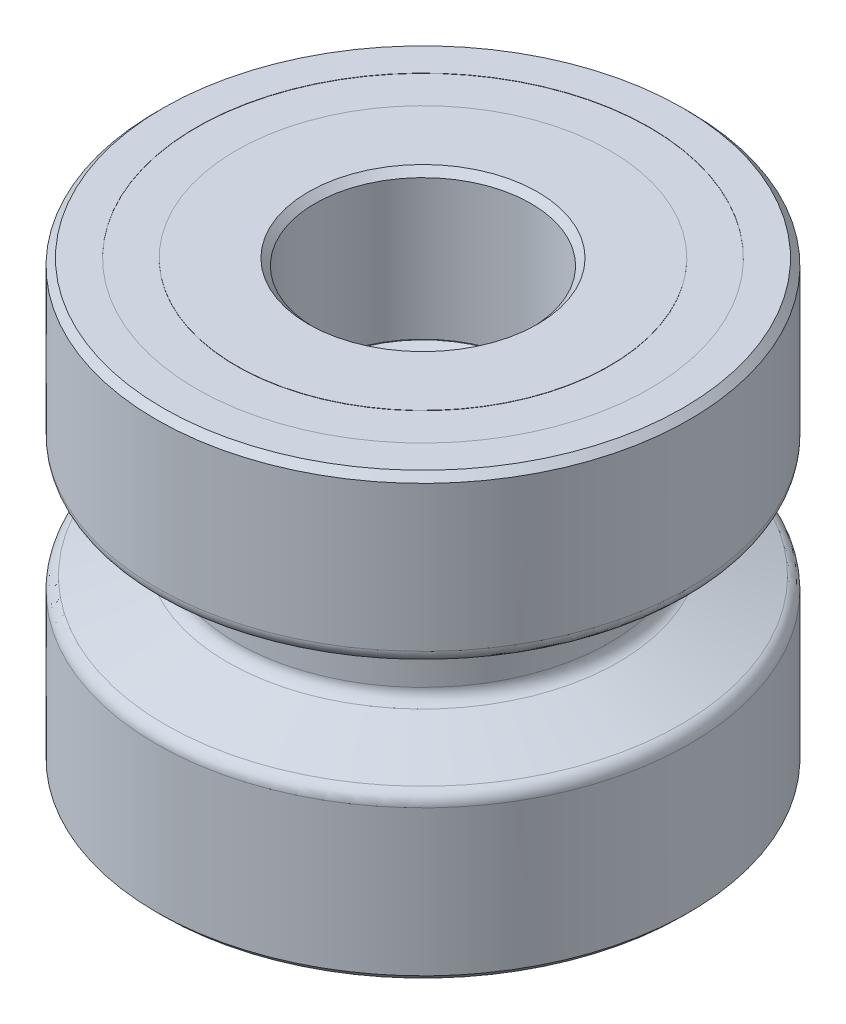
ISO-10303-21;
HEADER;
FILE_DESCRIPTION(('STEP AP214'),'2;1');
FILE_NAME('part.step','',(''),(''),'','','');
FILE_SCHEMA(('AUTOMOTIVE_DESIGN { 1 0 10303 214 1 1 1 1 }'));
ENDSEC;
DATA;
#1=APPLICATION_CONTEXT('core data for automotive mechanical design processes');
#2=APPLICATION_PROTOCOL_DEFINITION('international standard','automotive_design',2000,#1);
#3=PRODUCT_CONTEXT('',#1,'mechanical');
#4=PRODUCT('Part','Part','',(#3));
#5=PRODUCT_RELATED_PRODUCT_CATEGORY('part','',(#4));
#6=PRODUCT_DEFINITION_FORMATION('','',#4);
#7=PRODUCT_DEFINITION_CONTEXT('part definition',#1,'design');
#8=PRODUCT_DEFINITION('design','',#6,#7);
#9=PRODUCT_DEFINITION_SHAPE('','',#8);
#10=(LENGTH_UNIT() NAMED_UNIT(*) SI_UNIT(.MILLI.,.METRE.));
#11=(NAMED_UNIT(*) PLANE_ANGLE_UNIT() SI_UNIT($,.RADIAN.));
#12=(NAMED_UNIT(*) SI_UNIT($,.STERADIAN.) SOLID_ANGLE_UNIT());
#13=UNCERTAINTY_MEASURE_WITH_UNIT(LENGTH_MEASURE(1.E-05),#10,'distance_accuracy_value','');
#14=(GEOMETRIC_REPRESENTATION_CONTEXT(3) GLOBAL_UNCERTAINTY_ASSIGNED_CONTEXT((#13)) GLOBAL_UNIT_ASSIGNED_CONTEXT((#10,
#11,#12)) REPRESENTATION_CONTEXT('',''));
#15=CARTESIAN_POINT('',(0.,0.,0.));
#16=DIRECTION('',(0.,0.,1.));
#17=DIRECTION('',(1.,0.,0.));
#18=AXIS2_PLACEMENT_3D('',#15,#16,#17);
#19=CARTESIAN_POINT('',(0.,8.25,0.));
#20=DIRECTION('',(0.,1.,0.));
#21=DIRECTION('',(0.,0.,-1.));
#22=AXIS2_PLACEMENT_3D('',#19,#20,#21);
#23=PLANE('',#22);
#24=CARTESIAN_POINT('',(0.,8.25,0.));
#25=DIRECTION('',(0.,-1.,0.));
#26=DIRECTION('',(0.,0.,-1.));
#27=AXIS2_PLACEMENT_3D('',#24,#25,#26);
#28=CIRCLE('',#27,4.30000000000001);
#29=CARTESIAN_POINT('',(0.,8.25,-4.30000000000001));
#30=VERTEX_POINT('',#29);
#31=EDGE_CURVE('E65',#30,#30,#28,.F.);
#32=ORIENTED_EDGE('',*,*,#31,.F.);
#33=EDGE_LOOP('',(#32));
#34=FACE_BOUND('',#33,.T.);
#35=CARTESIAN_POINT('',(0.,8.25,0.));
#36=DIRECTION('',(0.,-1.,0.));
#37=DIRECTION('',(0.,0.,-1.));
#38=AXIS2_PLACEMENT_3D('',#35,#36,#37);
#39=CIRCLE('',#38,7.);
#40=CARTESIAN_POINT('',(0.,8.25,-7.));
#41=VERTEX_POINT('',#40);
#42=EDGE_CURVE('E121',#41,#41,#39,.T.);
#43=ORIENTED_EDGE('',*,*,#42,.F.);
#44=EDGE_LOOP('',(#43));
#45=FACE_BOUND('',#44,.T.);
#46=ADVANCED_FACE('F44',(#34,#45),#23,.T.);
#47=CARTESIAN_POINT('',(0.,8.251,0.));
#48=DIRECTION('',(0.,-1.,0.));
#49=DIRECTION('',(0.,0.,1.));
#50=AXIS2_PLACEMENT_3D('',#47,#48,#49);
#51=CYLINDRICAL_SURFACE('',#50,3.5);
#52=CARTESIAN_POINT('',(0.,2.45,0.));
#53=DIRECTION('',(0.,-1.,0.));
#54=DIRECTION('',(0.,0.,-1.));
#55=AXIS2_PLACEMENT_3D('',#52,#53,#54);
#56=CIRCLE('',#55,3.5);
#57=CARTESIAN_POINT('',(0.,2.45,-3.5));
#58=VERTEX_POINT('',#57);
#59=EDGE_CURVE('E10',#58,#58,#56,.T.);
#60=ORIENTED_EDGE('',*,*,#59,.F.);
#61=EDGE_LOOP('',(#60));
#62=FACE_BOUND('',#61,.T.);
#63=CARTESIAN_POINT('',(0.,-5.75,0.));
#64=DIRECTION('',(0.,1.,0.));
#65=DIRECTION('',(0.,0.,1.));
#66=AXIS2_PLACEMENT_3D('',#63,#64,#65);
#67=CIRCLE('',#66,3.5);
#68=CARTESIAN_POINT('',(0.,-5.75,3.5));
#69=VERTEX_POINT('',#68);
#70=EDGE_CURVE('E84',#69,#69,#67,.F.);
#71=ORIENTED_EDGE('',*,*,#70,.T.);
#72=EDGE_LOOP('',(#71));
#73=FACE_BOUND('',#72,.T.);
#74=ADVANCED_FACE('F139',(#62,#73),#51,.F.);
#75=CARTESIAN_POINT('',(0.,8.25,0.));
#76=DIRECTION('',(0.,-1.,0.));
#77=DIRECTION('',(0.,0.,1.));
#78=AXIS2_PLACEMENT_3D('',#75,#76,#77);
#79=CYLINDRICAL_SURFACE('',#78,10.);
#80=CARTESIAN_POINT('',(0.,-7.99999999999999,0.));
#81=DIRECTION('',(0.,-1.,0.));
#82=DIRECTION('',(0.,0.,-1.));
#83=AXIS2_PLACEMENT_3D('',#80,#81,#82);
#84=CIRCLE('',#83,10.);
#85=CARTESIAN_POINT('',(0.,-7.99999999999999,-10.));
#86=VERTEX_POINT('',#85);
#87=EDGE_CURVE('E79',#86,#86,#84,.T.);
#88=ORIENTED_EDGE('',*,*,#87,.F.);
#89=EDGE_LOOP('',(#88));
#90=FACE_BOUND('',#89,.T.);
#91=CARTESIAN_POINT('',(0.,-2.54201447190344,0.));
#92=DIRECTION('',(0.,1.,0.));
#93=DIRECTION('',(0.,0.,1.));
#94=AXIS2_PLACEMENT_3D('',#91,#92,#93);
#95=CIRCLE('',#94,10.);
#96=CARTESIAN_POINT('',(0.,-2.54201447190344,10.));
#97=VERTEX_POINT('',#96);
#98=EDGE_CURVE('E81',#97,#97,#95,.T.);
#99=ORIENTED_EDGE('',*,*,#98,.F.);
#100=EDGE_LOOP('',(#99));
#101=FACE_BOUND('',#100,.T.);
#102=ADVANCED_FACE('F150',(#90,#101),#79,.T.);
#103=CARTESIAN_POINT('',(0.,8.,0.));
#104=DIRECTION('',(0.,-1.,0.));
#105=DIRECTION('',(0.,0.,-1.));
#106=AXIS2_PLACEMENT_3D('',#103,#104,#105);
#107=CIRCLE('',#106,10.);
#108=CARTESIAN_POINT('',(0.,8.,-10.));
#109=VERTEX_POINT('',#108);
#110=EDGE_CURVE('E57',#109,#109,#107,.F.);
#111=ORIENTED_EDGE('',*,*,#110,.F.);
#112=EDGE_LOOP('',(#111));
#113=FACE_BOUND('',#112,.T.);
#114=CARTESIAN_POINT('',(0.,2.54201447190344,0.));
#115=DIRECTION('',(0.,1.,0.));
#116=DIRECTION('',(0.,0.,1.));
#117=AXIS2_PLACEMENT_3D('',#114,#115,#116);
#118=CIRCLE('',#117,10.);
#119=CARTESIAN_POINT('',(0.,2.54201447190344,10.));
#120=VERTEX_POINT('',#119);
#121=EDGE_CURVE('E91',#120,#120,#118,.F.);
#122=ORIENTED_EDGE('',*,*,#121,.F.);
#123=EDGE_LOOP('',(#122));
#124=FACE_BOUND('',#123,.T.);
#125=ADVANCED_FACE('F153',(#113,#124),#79,.T.);
#126=CARTESIAN_POINT('',(0.,8.25,0.));
#127=DIRECTION('',(0.,-1.,0.));
#128=DIRECTION('',(0.,0.,-1.));
#129=AXIS2_PLACEMENT_3D('',#126,#127,#128);
#130=CIRCLE('',#129,9.75);
#131=CARTESIAN_POINT('',(0.,8.25,-9.75));
#132=VERTEX_POINT('',#131);
#133=EDGE_CURVE('E58',#132,#132,#130,.T.);
#134=ORIENTED_EDGE('',*,*,#133,.F.);
#135=EDGE_LOOP('',(#134));
#136=FACE_BOUND('',#135,.T.);
#137=CARTESIAN_POINT('',(0.,8.25,0.));
#138=DIRECTION('',(0.,-1.,0.));
#139=DIRECTION('',(0.,0.,-1.));
#140=AXIS2_PLACEMENT_3D('',#137,#138,#139);
#141=CIRCLE('',#140,8.5);
#142=CARTESIAN_POINT('',(0.,8.25,-8.5));
#143=VERTEX_POINT('',#142);
#144=EDGE_CURVE('E117',#143,#143,#141,.T.);
#145=ORIENTED_EDGE('',*,*,#144,.T.);
#146=EDGE_LOOP('',(#145));
#147=FACE_BOUND('',#146,.T.);
#148=ADVANCED_FACE('F142',(#136,#147),#23,.T.);
#149=CARTESIAN_POINT('',(0.,-8.25,0.));
#150=DIRECTION('',(0.,1.,0.));
#151=DIRECTION('',(0.,0.,-1.));
#152=AXIS2_PLACEMENT_3D('',#149,#150,#151);
#153=PLANE('',#152);
#154=CARTESIAN_POINT('',(0.,-8.25,0.));
#155=DIRECTION('',(0.,-1.,0.));
#156=DIRECTION('',(0.,0.,-1.));
#157=AXIS2_PLACEMENT_3D('',#154,#155,#156);
#158=CIRCLE('',#157,9.74999999999999);
#159=CARTESIAN_POINT('',(0.,-8.25,-9.74999999999999));
#160=VERTEX_POINT('',#159);
#161=EDGE_CURVE('E73',#160,#160,#158,.F.);
#162=ORIENTED_EDGE('',*,*,#161,.F.);
#163=EDGE_LOOP('',(#162));
#164=FACE_BOUND('',#163,.T.);
#165=CARTESIAN_POINT('',(0.,-8.25,0.));
#166=DIRECTION('',(0.,-1.,0.));
#167=DIRECTION('',(0.,0.,-1.));
#168=AXIS2_PLACEMENT_3D('',#165,#166,#167);
#169=CIRCLE('',#168,4.30000000000001);
#170=CARTESIAN_POINT('',(0.,-8.25,-4.30000000000001));
#171=VERTEX_POINT('',#170);
#172=EDGE_CURVE('E77',#171,#171,#169,.T.);
#173=ORIENTED_EDGE('',*,*,#172,.F.);
#174=EDGE_LOOP('',(#173));
#175=FACE_BOUND('',#174,.T.);
#176=ADVANCED_FACE('F154',(#164,#175),#153,.F.);
#177=CARTESIAN_POINT('',(0.,-1.1,0.));
#178=DIRECTION('',(0.,-1.,0.));
#179=DIRECTION('',(0.,0.,1.));
#180=AXIS2_PLACEMENT_3D('',#177,#178,#179);
#181=CONICAL_SURFACE('',#180,7.,1.22173047639604);
#182=CARTESIAN_POINT('',(0.,-1.21974254128809,0.));
#183=DIRECTION('',(0.,1.,0.));
#184=DIRECTION('',(0.,0.,1.));
#185=AXIS2_PLACEMENT_3D('',#182,#183,#184);
#186=CIRCLE('',#185,7.32898992833717);
#187=CARTESIAN_POINT('',(0.,-1.21974254128809,7.32898992833717));
#188=VERTEX_POINT('',#187);
#189=EDGE_CURVE('E99',#188,#188,#186,.T.);
#190=ORIENTED_EDGE('',*,*,#189,.F.);
#191=EDGE_LOOP('',(#190));
#192=FACE_BOUND('',#191,.T.);
#193=CARTESIAN_POINT('',(0.,-2.07216816151049,0.));
#194=DIRECTION('',(0.,1.,0.));
#195=DIRECTION('',(0.,0.,1.));
#196=AXIS2_PLACEMENT_3D('',#193,#194,#195);
#197=CIRCLE('',#196,9.67101007166283);
#198=CARTESIAN_POINT('',(0.,-2.07216816151049,9.67101007166283));
#199=VERTEX_POINT('',#198);
#200=EDGE_CURVE('E104',#199,#199,#197,.F.);
#201=ORIENTED_EDGE('',*,*,#200,.F.);
#202=EDGE_LOOP('',(#201));
#203=FACE_BOUND('',#202,.T.);
#204=ADVANCED_FACE('F158',(#192,#203),#181,.T.);
#205=CARTESIAN_POINT('',(0.,8.25,0.));
#206=DIRECTION('',(0.,1.,0.));
#207=DIRECTION('',(0.,0.,-1.));
#208=AXIS2_PLACEMENT_3D('',#205,#206,#207);
#209=CYLINDRICAL_SURFACE('',#208,7.);
#210=CARTESIAN_POINT('',(0.,-0.749896230895143,0.));
#211=DIRECTION('',(0.,-1.,0.));
#212=DIRECTION('',(0.,0.,-1.));
#213=AXIS2_PLACEMENT_3D('',#210,#211,#212);
#214=CIRCLE('',#213,7.);
#215=CARTESIAN_POINT('',(0.,-0.749896230895143,-7.));
#216=VERTEX_POINT('',#215);
#217=EDGE_CURVE('E106',#216,#216,#214,.T.);
#218=ORIENTED_EDGE('',*,*,#217,.F.);
#219=EDGE_LOOP('',(#218));
#220=FACE_BOUND('',#219,.T.);
#221=CARTESIAN_POINT('',(0.,0.749896230895143,0.));
#222=DIRECTION('',(0.,-1.,0.));
#223=DIRECTION('',(0.,0.,-1.));
#224=AXIS2_PLACEMENT_3D('',#221,#222,#223);
#225=CIRCLE('',#224,7.);
#226=CARTESIAN_POINT('',(0.,0.749896230895143,-7.));
#227=VERTEX_POINT('',#226);
#228=EDGE_CURVE('E90',#227,#227,#225,.F.);
#229=ORIENTED_EDGE('',*,*,#228,.F.);
#230=EDGE_LOOP('',(#229));
#231=FACE_BOUND('',#230,.T.);
#232=ADVANCED_FACE('F198',(#220,#231),#209,.T.);
#233=CARTESIAN_POINT('',(0.,2.19191070279859,0.));
#234=DIRECTION('',(0.,1.,0.));
#235=DIRECTION('',(0.,0.,-1.));
#236=AXIS2_PLACEMENT_3D('',#233,#234,#235);
#237=CONICAL_SURFACE('',#236,10.,1.22173047639604);
#238=CARTESIAN_POINT('',(0.,1.2197425412881,0.));
#239=DIRECTION('',(0.,-1.,0.));
#240=DIRECTION('',(0.,0.,-1.));
#241=AXIS2_PLACEMENT_3D('',#238,#239,#240);
#242=CIRCLE('',#241,7.32898992833717);
#243=CARTESIAN_POINT('',(0.,1.2197425412881,-7.32898992833717));
#244=VERTEX_POINT('',#243);
#245=EDGE_CURVE('E92',#244,#244,#242,.T.);
#246=ORIENTED_EDGE('',*,*,#245,.F.);
#247=EDGE_LOOP('',(#246));
#248=FACE_BOUND('',#247,.T.);
#249=CARTESIAN_POINT('',(0.,2.07216816151049,0.));
#250=DIRECTION('',(0.,-1.,0.));
#251=DIRECTION('',(0.,0.,-1.));
#252=AXIS2_PLACEMENT_3D('',#249,#250,#251);
#253=CIRCLE('',#252,9.67101007166283);
#254=CARTESIAN_POINT('',(0.,2.07216816151049,-9.67101007166283));
#255=VERTEX_POINT('',#254);
#256=EDGE_CURVE('E100',#255,#255,#253,.F.);
#257=ORIENTED_EDGE('',*,*,#256,.F.);
#258=EDGE_LOOP('',(#257));
#259=FACE_BOUND('',#258,.T.);
#260=ADVANCED_FACE('F193',(#248,#259),#237,.T.);
#261=CARTESIAN_POINT('',(0.,-0.749896230895143,0.));
#262=DIRECTION('',(0.,1.,0.));
#263=DIRECTION('',(0.,0.,-1.));
#264=AXIS2_PLACEMENT_3D('',#261,#262,#263);
#265=TOROIDAL_SURFACE('',#264,7.5,0.5);
#266=ORIENTED_EDGE('',*,*,#189,.T.);
#267=EDGE_LOOP('',(#266));
#268=FACE_BOUND('',#267,.T.);
#269=ORIENTED_EDGE('',*,*,#217,.T.);
#270=EDGE_LOOP('',(#269));
#271=FACE_BOUND('',#270,.T.);
#272=ADVANCED_FACE('F199',(#268,#271),#265,.F.);
#273=CARTESIAN_POINT('',(0.,0.749896230895143,0.));
#274=DIRECTION('',(0.,1.,0.));
#275=DIRECTION('',(0.,0.,-1.));
#276=AXIS2_PLACEMENT_3D('',#273,#274,#275);
#277=TOROIDAL_SURFACE('',#276,7.5,0.5);
#278=ORIENTED_EDGE('',*,*,#228,.T.);
#279=EDGE_LOOP('',(#278));
#280=FACE_BOUND('',#279,.T.);
#281=ORIENTED_EDGE('',*,*,#245,.T.);
#282=EDGE_LOOP('',(#281));
#283=FACE_BOUND('',#282,.T.);
#284=ADVANCED_FACE('F219',(#280,#283),#277,.F.);
#285=CARTESIAN_POINT('',(0.,2.54201447190344,0.));
#286=DIRECTION('',(0.,-1.,0.));
#287=DIRECTION('',(0.,0.,1.));
#288=AXIS2_PLACEMENT_3D('',#285,#286,#287);
#289=TOROIDAL_SURFACE('',#288,9.5,0.5);
#290=ORIENTED_EDGE('',*,*,#256,.T.);
#291=EDGE_LOOP('',(#290));
#292=FACE_BOUND('',#291,.T.);
#293=ORIENTED_EDGE('',*,*,#121,.T.);
#294=EDGE_LOOP('',(#293));
#295=FACE_BOUND('',#294,.T.);
#296=ADVANCED_FACE('F211',(#292,#295),#289,.T.);
#297=CARTESIAN_POINT('',(0.,-2.54201447190344,0.));
#298=DIRECTION('',(0.,-1.,0.));
#299=DIRECTION('',(0.,0.,1.));
#300=AXIS2_PLACEMENT_3D('',#297,#298,#299);
#301=TOROIDAL_SURFACE('',#300,9.5,0.5);
#302=ORIENTED_EDGE('',*,*,#98,.T.);
#303=EDGE_LOOP('',(#302));
#304=FACE_BOUND('',#303,.T.);
#305=ORIENTED_EDGE('',*,*,#200,.T.);
#306=EDGE_LOOP('',(#305));
#307=FACE_BOUND('',#306,.T.);
#308=ADVANCED_FACE('F189',(#304,#307),#301,.T.);
#309=CARTESIAN_POINT('',(0.,-5.75,0.));
#310=DIRECTION('',(0.,-1.,0.));
#311=DIRECTION('',(0.,0.,1.));
#312=AXIS2_PLACEMENT_3D('',#309,#310,#311);
#313=PLANE('',#312);
#314=CARTESIAN_POINT('',(0.,-5.75,0.));
#315=DIRECTION('',(0.,1.,0.));
#316=DIRECTION('',(0.,0.,1.));
#317=AXIS2_PLACEMENT_3D('',#314,#315,#316);
#318=CIRCLE('',#317,4.05);
#319=CARTESIAN_POINT('',(0.,-5.75,4.05));
#320=VERTEX_POINT('',#319);
#321=EDGE_CURVE('E88',#320,#320,#318,.T.);
#322=ORIENTED_EDGE('',*,*,#321,.F.);
#323=EDGE_LOOP('',(#322));
#324=FACE_BOUND('',#323,.T.);
#325=ORIENTED_EDGE('',*,*,#70,.F.);
#326=EDGE_LOOP('',(#325));
#327=FACE_BOUND('',#326,.T.);
#328=ADVANCED_FACE('F190',(#324,#327),#313,.T.);
#329=CARTESIAN_POINT('',(0.,-5.75,0.));
#330=DIRECTION('',(0.,-1.,0.));
#331=DIRECTION('',(0.,0.,1.));
#332=AXIS2_PLACEMENT_3D('',#329,#330,#331);
#333=CYLINDRICAL_SURFACE('',#332,4.05);
#334=CARTESIAN_POINT('',(0.,-7.99999999999999,0.));
#335=DIRECTION('',(0.,-1.,0.));
#336=DIRECTION('',(0.,0.,-1.));
#337=AXIS2_PLACEMENT_3D('',#334,#335,#336);
#338=CIRCLE('',#337,4.05);
#339=CARTESIAN_POINT('',(0.,-7.99999999999999,-4.05));
#340=VERTEX_POINT('',#339);
#341=EDGE_CURVE('E71',#340,#340,#338,.F.);
#342=ORIENTED_EDGE('',*,*,#341,.F.);
#343=EDGE_LOOP('',(#342));
#344=FACE_BOUND('',#343,.T.);
#345=ORIENTED_EDGE('',*,*,#321,.T.);
#346=EDGE_LOOP('',(#345));
#347=FACE_BOUND('',#346,.T.);
#348=ADVANCED_FACE('F182',(#344,#347),#333,.F.);
#349=CARTESIAN_POINT('',(0.,2.75,0.));
#350=DIRECTION('',(0.,1.,0.));
#351=DIRECTION('',(0.,0.,-1.));
#352=AXIS2_PLACEMENT_3D('',#349,#350,#351);
#353=PLANE('',#352);
#354=CARTESIAN_POINT('',(0.,2.75,0.));
#355=DIRECTION('',(0.,-1.,0.));
#356=DIRECTION('',(0.,0.,-1.));
#357=AXIS2_PLACEMENT_3D('',#354,#355,#356);
#358=CIRCLE('',#357,4.01961524227066);
#359=CARTESIAN_POINT('',(0.,2.75,-4.01961524227066));
#360=VERTEX_POINT('',#359);
#361=EDGE_CURVE('E55',#360,#360,#358,.F.);
#362=ORIENTED_EDGE('',*,*,#361,.F.);
#363=EDGE_LOOP('',(#362));
#364=FACE_BOUND('',#363,.T.);
#365=CARTESIAN_POINT('',(0.,2.75,0.));
#366=DIRECTION('',(0.,-1.,0.));
#367=DIRECTION('',(0.,0.,-1.));
#368=AXIS2_PLACEMENT_3D('',#365,#366,#367);
#369=CIRCLE('',#368,4.05);
#370=CARTESIAN_POINT('',(0.,2.75,-4.05));
#371=VERTEX_POINT('',#370);
#372=EDGE_CURVE('E111',#371,#371,#369,.T.);
#373=ORIENTED_EDGE('',*,*,#372,.F.);
#374=EDGE_LOOP('',(#373));
#375=FACE_BOUND('',#374,.T.);
#376=ADVANCED_FACE('F177',(#364,#375),#353,.T.);
#377=CARTESIAN_POINT('',(0.,2.75,0.));
#378=DIRECTION('',(0.,1.,0.));
#379=DIRECTION('',(0.,0.,-1.));
#380=AXIS2_PLACEMENT_3D('',#377,#378,#379);
#381=CYLINDRICAL_SURFACE('',#380,4.05);
#382=CARTESIAN_POINT('',(0.,7.99999999999999,0.));
#383=DIRECTION('',(0.,-1.,0.));
#384=DIRECTION('',(0.,0.,-1.));
#385=AXIS2_PLACEMENT_3D('',#382,#383,#384);
#386=CIRCLE('',#385,4.05);
#387=CARTESIAN_POINT('',(0.,7.99999999999999,-4.05));
#388=VERTEX_POINT('',#387);
#389=EDGE_CURVE('E66',#388,#388,#386,.T.);
#390=ORIENTED_EDGE('',*,*,#389,.F.);
#391=EDGE_LOOP('',(#390));
#392=FACE_BOUND('',#391,.T.);
#393=ORIENTED_EDGE('',*,*,#372,.T.);
#394=EDGE_LOOP('',(#393));
#395=FACE_BOUND('',#394,.T.);
#396=ADVANCED_FACE('F169',(#392,#395),#381,.F.);
#397=CARTESIAN_POINT('',(0.,8.24,0.));
#398=DIRECTION('',(0.,1.,0.));
#399=DIRECTION('',(0.,0.,-1.));
#400=AXIS2_PLACEMENT_3D('',#397,#398,#399);
#401=CYLINDRICAL_SURFACE('',#400,8.5);
#402=CARTESIAN_POINT('',(0.,8.24,0.));
#403=DIRECTION('',(0.,-1.,0.));
#404=DIRECTION('',(0.,0.,-1.));
#405=AXIS2_PLACEMENT_3D('',#402,#403,#404);
#406=CIRCLE('',#405,8.5);
#407=CARTESIAN_POINT('',(0.,8.24,-8.5));
#408=VERTEX_POINT('',#407);
#409=EDGE_CURVE('E116',#408,#408,#406,.T.);
#410=CARTESIAN_POINT('',(0.,8.24,-8.5));
#411=CARTESIAN_POINT('',(0.,8.24010416666667,-8.5));
#412=CARTESIAN_POINT('',(0.,8.24020833333334,-8.5));
#413=CARTESIAN_POINT('',(0.,8.24041666666667,-8.5));
#414=CARTESIAN_POINT('',(0.,8.24052083333333,-8.5));
#415=CARTESIAN_POINT('',(0.,8.24072916666667,-8.5));
#416=CARTESIAN_POINT('',(0.,8.24083333333333,-8.5));
#417=CARTESIAN_POINT('',(0.,8.24104166666667,-8.5));
#418=CARTESIAN_POINT('',(0.,8.24114583333333,-8.5));
#419=CARTESIAN_POINT('',(0.,8.24135416666667,-8.5));
#420=CARTESIAN_POINT('',(0.,8.24145833333334,-8.5));
#421=CARTESIAN_POINT('',(0.,8.24166666666667,-8.5));
#422=CARTESIAN_POINT('',(0.,8.24177083333334,-8.5));
#423=CARTESIAN_POINT('',(0.,8.24197916666667,-8.5));
#424=CARTESIAN_POINT('',(0.,8.24208333333333,-8.5));
#425=CARTESIAN_POINT('',(0.,8.24229166666667,-8.5));
#426=CARTESIAN_POINT('',(0.,8.24239583333333,-8.5));
#427=CARTESIAN_POINT('',(0.,8.24260416666667,-8.5));
#428=CARTESIAN_POINT('',(0.,8.24270833333333,-8.5));
#429=CARTESIAN_POINT('',(0.,8.24291666666667,-8.5));
#430=CARTESIAN_POINT('',(0.,8.24302083333333,-8.5));
#431=CARTESIAN_POINT('',(0.,8.24322916666667,-8.5));
#432=CARTESIAN_POINT('',(0.,8.24333333333334,-8.5));
#433=CARTESIAN_POINT('',(0.,8.24354166666667,-8.5));
#434=CARTESIAN_POINT('',(0.,8.24364583333333,-8.5));
#435=CARTESIAN_POINT('',(0.,8.24385416666667,-8.5));
#436=CARTESIAN_POINT('',(0.,8.24395833333333,-8.5));
#437=CARTESIAN_POINT('',(0.,8.24416666666667,-8.5));
#438=CARTESIAN_POINT('',(0.,8.24427083333333,-8.5));
#439=CARTESIAN_POINT('',(0.,8.24447916666667,-8.5));
#440=CARTESIAN_POINT('',(0.,8.24458333333333,-8.5));
#441=CARTESIAN_POINT('',(0.,8.24479166666667,-8.5));
#442=CARTESIAN_POINT('',(0.,8.24489583333333,-8.5));
#443=CARTESIAN_POINT('',(0.,8.24510416666667,-8.5));
#444=CARTESIAN_POINT('',(0.,8.24520833333334,-8.5));
#445=CARTESIAN_POINT('',(0.,8.24541666666667,-8.5));
#446=CARTESIAN_POINT('',(0.,8.24552083333333,-8.5));
#447=CARTESIAN_POINT('',(0.,8.24572916666667,-8.5));
#448=CARTESIAN_POINT('',(0.,8.24583333333333,-8.5));
#449=CARTESIAN_POINT('',(0.,8.24604166666667,-8.5));
#450=CARTESIAN_POINT('',(0.,8.24614583333334,-8.5));
#451=CARTESIAN_POINT('',(0.,8.24635416666667,-8.5));
#452=CARTESIAN_POINT('',(0.,8.24645833333333,-8.5));
#453=CARTESIAN_POINT('',(0.,8.24666666666667,-8.5));
#454=CARTESIAN_POINT('',(0.,8.24677083333333,-8.5));
#455=CARTESIAN_POINT('',(0.,8.24697916666667,-8.5));
#456=CARTESIAN_POINT('',(0.,8.24708333333333,-8.5));
#457=CARTESIAN_POINT('',(0.,8.24729166666667,-8.5));
#458=CARTESIAN_POINT('',(0.,8.24739583333333,-8.5));
#459=CARTESIAN_POINT('',(0.,8.24760416666667,-8.5));
#460=CARTESIAN_POINT('',(0.,8.24770833333333,-8.5));
#461=CARTESIAN_POINT('',(0.,8.24791666666667,-8.5));
#462=CARTESIAN_POINT('',(0.,8.24802083333334,-8.5));
#463=CARTESIAN_POINT('',(0.,8.24822916666667,-8.5));
#464=CARTESIAN_POINT('',(0.,8.24833333333333,-8.5));
#465=CARTESIAN_POINT('',(0.,8.24854166666667,-8.5));
#466=CARTESIAN_POINT('',(0.,8.24864583333333,-8.5));
#467=CARTESIAN_POINT('',(0.,8.24885416666667,-8.5));
#468=CARTESIAN_POINT('',(0.,8.24895833333333,-8.5));
#469=CARTESIAN_POINT('',(0.,8.24916666666667,-8.5));
#470=CARTESIAN_POINT('',(0.,8.24927083333333,-8.5));
#471=CARTESIAN_POINT('',(0.,8.24947916666667,-8.5));
#472=CARTESIAN_POINT('',(0.,8.24958333333333,-8.5));
#473=CARTESIAN_POINT('',(0.,8.24979166666667,-8.5));
#474=CARTESIAN_POINT('',(0.,8.24989583333334,-8.5));
#475=CARTESIAN_POINT('',(0.,8.25,-8.5));
#476=B_SPLINE_CURVE_WITH_KNOTS('',3,(#410,#411,#412,#413,#414,#415,#416,#417,#418,#419,#420,
#421,#422,#423,#424,#425,#426,#427,#428,#429,#430,#431,#432,#433,#434,#435,#436,#437,#438,#439,
#440,#441,#442,#443,#444,#445,#446,#447,#448,#449,#450,#451,#452,#453,#454,#455,#456,#457,#458,
#459,#460,#461,#462,#463,#464,#465,#466,#467,#468,#469,#470,#471,#472,#473,#474,#475),
.UNSPECIFIED.,.F.,.F.,(4,2,2,2,2,2,2,2,2,2,2,2,2,2,2,2,2,2,2,2,2,2,2,2,2,2,2,2,2,2,2,2,4),(0.,
0.000312499999998578,0.00062499999999889,0.000937499999999203,0.00124999999999952,
0.00156249999999983,0.00187499999999841,0.00218749999999872,0.00249999999999903,
0.00281249999999934,0.00312499999999966,0.00343749999999823,0.00374999999999855,
0.00406249999999886,0.00437499999999917,0.00468749999999948,0.0049999999999998,
0.00531249999999837,0.00562499999999869,0.005937499999999,0.00624999999999931,
0.00656249999999962,0.0068749999999982,0.00718749999999851,0.00749999999999883,
0.00781249999999914,0.00812499999999945,0.00843749999999803,0.00874999999999834,
0.00906249999999865,0.00937499999999897,0.00968749999999928,0.00999999999999959),.UNSPECIFIED.);
#477=EDGE_CURVE('BSEAM166',#408,#143,#476,.T.);
#478=ORIENTED_EDGE('',*,*,#409,.T.);
#479=ORIENTED_EDGE('',*,*,#144,.F.);
#480=ORIENTED_EDGE('',*,*,#477,.T.);
#481=ORIENTED_EDGE('',*,*,#477,.F.);
#482=EDGE_LOOP('',(#478,#480,#479,#481));
#483=FACE_BOUND('',#482,.T.);
#484=ADVANCED_FACE('F166',(#483),#401,.F.);
#485=CARTESIAN_POINT('',(0.,8.24,0.));
#486=DIRECTION('',(0.,1.,0.));
#487=DIRECTION('',(0.,0.,-1.));
#488=AXIS2_PLACEMENT_3D('',#485,#486,#487);
#489=PLANE('',#488);
#490=CARTESIAN_POINT('',(0.,8.24,0.));
#491=DIRECTION('',(0.,-1.,0.));
#492=DIRECTION('',(0.,0.,-1.));
#493=AXIS2_PLACEMENT_3D('',#490,#491,#492);
#494=CIRCLE('',#493,7.);
#495=CARTESIAN_POINT('',(0.,8.24,-7.));
#496=VERTEX_POINT('',#495);
#497=EDGE_CURVE('E120',#496,#496,#494,.T.);
#498=ORIENTED_EDGE('',*,*,#497,.T.);
#499=EDGE_LOOP('',(#498));
#500=FACE_BOUND('',#499,.T.);
#501=ORIENTED_EDGE('',*,*,#409,.F.);
#502=EDGE_LOOP('',(#501));
#503=FACE_BOUND('',#502,.T.);
#504=ADVANCED_FACE('F129',(#500,#503),#489,.T.);
#505=CARTESIAN_POINT('',(0.,8.24,0.));
#506=DIRECTION('',(0.,1.,0.));
#507=DIRECTION('',(0.,0.,-1.));
#508=AXIS2_PLACEMENT_3D('',#505,#506,#507);
#509=CYLINDRICAL_SURFACE('',#508,7.);
#510=CARTESIAN_POINT('',(0.,8.24,-7.));
#511=CARTESIAN_POINT('',(0.,8.24010416666667,-7.));
#512=CARTESIAN_POINT('',(0.,8.24020833333334,-7.));
#513=CARTESIAN_POINT('',(0.,8.24041666666667,-7.));
#514=CARTESIAN_POINT('',(0.,8.24052083333333,-7.));
#515=CARTESIAN_POINT('',(0.,8.24072916666667,-7.));
#516=CARTESIAN_POINT('',(0.,8.24083333333333,-7.));
#517=CARTESIAN_POINT('',(0.,8.24104166666667,-7.));
#518=CARTESIAN_POINT('',(0.,8.24114583333333,-7.));
#519=CARTESIAN_POINT('',(0.,8.24135416666667,-7.));
#520=CARTESIAN_POINT('',(0.,8.24145833333334,-7.));
#521=CARTESIAN_POINT('',(0.,8.24166666666667,-7.));
#522=CARTESIAN_POINT('',(0.,8.24177083333334,-7.));
#523=CARTESIAN_POINT('',(0.,8.24197916666667,-7.));
#524=CARTESIAN_POINT('',(0.,8.24208333333333,-7.));
#525=CARTESIAN_POINT('',(0.,8.24229166666667,-7.));
#526=CARTESIAN_POINT('',(0.,8.24239583333333,-7.));
#527=CARTESIAN_POINT('',(0.,8.24260416666667,-7.));
#528=CARTESIAN_POINT('',(0.,8.24270833333333,-7.));
#529=CARTESIAN_POINT('',(0.,8.24291666666667,-7.));
#530=CARTESIAN_POINT('',(0.,8.24302083333333,-7.));
#531=CARTESIAN_POINT('',(0.,8.24322916666667,-7.));
#532=CARTESIAN_POINT('',(0.,8.24333333333334,-7.));
#533=CARTESIAN_POINT('',(0.,8.24354166666667,-7.));
#534=CARTESIAN_POINT('',(0.,8.24364583333333,-7.));
#535=CARTESIAN_POINT('',(0.,8.24385416666667,-7.));
#536=CARTESIAN_POINT('',(0.,8.24395833333333,-7.));
#537=CARTESIAN_POINT('',(0.,8.24416666666667,-7.));
#538=CARTESIAN_POINT('',(0.,8.24427083333333,-7.));
#539=CARTESIAN_POINT('',(0.,8.24447916666667,-7.));
#540=CARTESIAN_POINT('',(0.,8.24458333333333,-7.));
#541=CARTESIAN_POINT('',(0.,8.24479166666667,-7.));
#542=CARTESIAN_POINT('',(0.,8.24489583333333,-7.));
#543=CARTESIAN_POINT('',(0.,8.24510416666667,-7.));
#544=CARTESIAN_POINT('',(0.,8.24520833333334,-7.));
#545=CARTESIAN_POINT('',(0.,8.24541666666667,-7.));
#546=CARTESIAN_POINT('',(0.,8.24552083333333,-7.));
#547=CARTESIAN_POINT('',(0.,8.24572916666667,-7.));
#548=CARTESIAN_POINT('',(0.,8.24583333333333,-7.));
#549=CARTESIAN_POINT('',(0.,8.24604166666667,-7.));
#550=CARTESIAN_POINT('',(0.,8.24614583333334,-7.));
#551=CARTESIAN_POINT('',(0.,8.24635416666667,-7.));
#552=CARTESIAN_POINT('',(0.,8.24645833333333,-7.));
#553=CARTESIAN_POINT('',(0.,8.24666666666667,-7.));
#554=CARTESIAN_POINT('',(0.,8.24677083333333,-7.));
#555=CARTESIAN_POINT('',(0.,8.24697916666667,-7.));
#556=CARTESIAN_POINT('',(0.,8.24708333333333,-7.));
#557=CARTESIAN_POINT('',(0.,8.24729166666667,-7.));
#558=CARTESIAN_POINT('',(0.,8.24739583333333,-7.));
#559=CARTESIAN_POINT('',(0.,8.24760416666667,-7.));
#560=CARTESIAN_POINT('',(0.,8.24770833333333,-7.));
#561=CARTESIAN_POINT('',(0.,8.24791666666667,-7.));
#562=CARTESIAN_POINT('',(0.,8.24802083333334,-7.));
#563=CARTESIAN_POINT('',(0.,8.24822916666667,-7.));
#564=CARTESIAN_POINT('',(0.,8.24833333333333,-7.));
#565=CARTESIAN_POINT('',(0.,8.24854166666667,-7.));
#566=CARTESIAN_POINT('',(0.,8.24864583333333,-7.));
#567=CARTESIAN_POINT('',(0.,8.24885416666667,-7.));
#568=CARTESIAN_POINT('',(0.,8.24895833333333,-7.));
#569=CARTESIAN_POINT('',(0.,8.24916666666667,-7.));
#570=CARTESIAN_POINT('',(0.,8.24927083333333,-7.));
#571=CARTESIAN_POINT('',(0.,8.24947916666667,-7.));
#572=CARTESIAN_POINT('',(0.,8.24958333333333,-7.));
#573=CARTESIAN_POINT('',(0.,8.24979166666667,-7.));
#574=CARTESIAN_POINT('',(0.,8.24989583333334,-7.));
#575=CARTESIAN_POINT('',(0.,8.25,-7.));
#576=B_SPLINE_CURVE_WITH_KNOTS('',3,(#510,#511,#512,#513,#514,#515,#516,#517,#518,#519,#520,
#521,#522,#523,#524,#525,#526,#527,#528,#529,#530,#531,#532,#533,#534,#535,#536,#537,#538,#539,
#540,#541,#542,#543,#544,#545,#546,#547,#548,#549,#550,#551,#552,#553,#554,#555,#556,#557,#558,
#559,#560,#561,#562,#563,#564,#565,#566,#567,#568,#569,#570,#571,#572,#573,#574,#575),
.UNSPECIFIED.,.F.,.F.,(4,2,2,2,2,2,2,2,2,2,2,2,2,2,2,2,2,2,2,2,2,2,2,2,2,2,2,2,2,2,2,2,4),(0.,
0.000312499999998578,0.00062499999999889,0.000937499999999203,0.00124999999999952,
0.00156249999999983,0.00187499999999841,0.00218749999999872,0.00249999999999903,
0.00281249999999934,0.00312499999999966,0.00343749999999823,0.00374999999999855,
0.00406249999999886,0.00437499999999917,0.00468749999999948,0.0049999999999998,
0.00531249999999837,0.00562499999999869,0.005937499999999,0.00624999999999931,
0.00656249999999962,0.0068749999999982,0.00718749999999851,0.00749999999999883,
0.00781249999999914,0.00812499999999945,0.00843749999999803,0.00874999999999834,
0.00906249999999865,0.00937499999999897,0.00968749999999928,0.00999999999999959),.UNSPECIFIED.);
#577=EDGE_CURVE('BSEAM135',#496,#41,#576,.T.);
#578=ORIENTED_EDGE('',*,*,#497,.F.);
#579=ORIENTED_EDGE('',*,*,#42,.T.);
#580=ORIENTED_EDGE('',*,*,#577,.T.);
#581=ORIENTED_EDGE('',*,*,#577,.F.);
#582=EDGE_LOOP('',(#578,#580,#579,#581));
#583=FACE_BOUND('',#582,.T.);
#584=ADVANCED_FACE('F135',(#583),#509,.T.);
#585=CARTESIAN_POINT('',(0.,-7.99999999999999,0.));
#586=DIRECTION('',(0.,1.,0.));
#587=DIRECTION('',(0.,0.,-1.));
#588=AXIS2_PLACEMENT_3D('',#585,#586,#587);
#589=CONICAL_SURFACE('',#588,10.,0.785398163397448);
#590=ORIENTED_EDGE('',*,*,#161,.T.);
#591=EDGE_LOOP('',(#590));
#592=FACE_BOUND('',#591,.T.);
#593=ORIENTED_EDGE('',*,*,#87,.T.);
#594=EDGE_LOOP('',(#593));
#595=FACE_BOUND('',#594,.T.);
#596=ADVANCED_FACE('F134',(#592,#595),#589,.T.);
#597=CARTESIAN_POINT('',(0.,-7.99999999999999,0.));
#598=DIRECTION('',(0.,-1.,0.));
#599=DIRECTION('',(0.,0.,1.));
#600=AXIS2_PLACEMENT_3D('',#597,#598,#599);
#601=CONICAL_SURFACE('',#600,4.05,0.785398163397455);
#602=ORIENTED_EDGE('',*,*,#172,.T.);
#603=EDGE_LOOP('',(#602));
#604=FACE_BOUND('',#603,.T.);
#605=ORIENTED_EDGE('',*,*,#341,.T.);
#606=EDGE_LOOP('',(#605));
#607=FACE_BOUND('',#606,.T.);
#608=ADVANCED_FACE('F226',(#604,#607),#601,.F.);
#609=CARTESIAN_POINT('',(0.,7.99999999999999,0.));
#610=DIRECTION('',(0.,1.,0.));
#611=DIRECTION('',(0.,0.,-1.));
#612=AXIS2_PLACEMENT_3D('',#609,#610,#611);
#613=CONICAL_SURFACE('',#612,4.05,0.785398163397455);
#614=ORIENTED_EDGE('',*,*,#31,.T.);
#615=EDGE_LOOP('',(#614));
#616=FACE_BOUND('',#615,.T.);
#617=ORIENTED_EDGE('',*,*,#389,.T.);
#618=EDGE_LOOP('',(#617));
#619=FACE_BOUND('',#618,.T.);
#620=ADVANCED_FACE('F229',(#616,#619),#613,.F.);
#621=CARTESIAN_POINT('',(0.,8.25,0.));
#622=DIRECTION('',(0.,-1.,0.));
#623=DIRECTION('',(0.,0.,1.));
#624=AXIS2_PLACEMENT_3D('',#621,#622,#623);
#625=CONICAL_SURFACE('',#624,9.75,0.785398163397448);
#626=ORIENTED_EDGE('',*,*,#110,.T.);
#627=EDGE_LOOP('',(#626));
#628=FACE_BOUND('',#627,.T.);
#629=ORIENTED_EDGE('',*,*,#133,.T.);
#630=EDGE_LOOP('',(#629));
#631=FACE_BOUND('',#630,.T.);
#632=ADVANCED_FACE('F232',(#628,#631),#625,.T.);
#633=CARTESIAN_POINT('',(0.,2.75,0.));
#634=DIRECTION('',(0.,1.,0.));
#635=DIRECTION('',(0.,0.,-1.));
#636=AXIS2_PLACEMENT_3D('',#633,#634,#635);
#637=CONICAL_SURFACE('',#636,4.01961524227066,1.0471975511966);
#638=ORIENTED_EDGE('',*,*,#59,.T.);
#639=EDGE_LOOP('',(#638));
#640=FACE_BOUND('',#639,.T.);
#641=ORIENTED_EDGE('',*,*,#361,.T.);
#642=EDGE_LOOP('',(#641));
#643=FACE_BOUND('',#642,.T.);
#644=ADVANCED_FACE('F50',(#640,#643),#637,.F.);
#645=CLOSED_SHELL('',(#46,#74,#102,#125,#148,#176,#204,#232,#260,#272,#284,#296,#308,#328,#348,
#376,#396,#484,#504,#584,#596,#608,#620,#632,#644));
#646=MANIFOLD_SOLID_BREP('B2',#645);
#647=ADVANCED_BREP_SHAPE_REPRESENTATION('',(#18,#646),#14);
#648=SHAPE_DEFINITION_REPRESENTATION(#9,#647);
ENDSEC;
END-ISO-10303-21;
